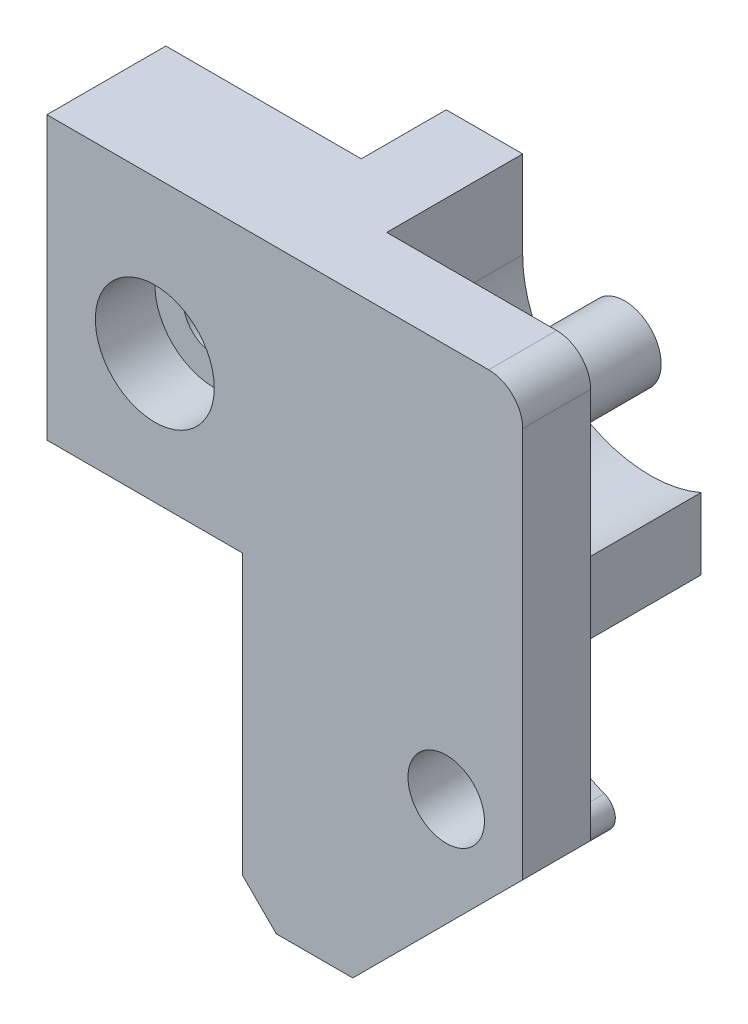
ISO-10303-21;
HEADER;
FILE_DESCRIPTION(('STEP AP214'),'2;1');
FILE_NAME('part.step','',(''),(''),'','','');
FILE_SCHEMA(('AUTOMOTIVE_DESIGN { 1 0 10303 214 1 1 1 1 }'));
ENDSEC;
DATA;
#1=APPLICATION_CONTEXT('core data for automotive mechanical design processes');
#2=APPLICATION_PROTOCOL_DEFINITION('international standard','automotive_design',2000,#1);
#3=PRODUCT_CONTEXT('',#1,'mechanical');
#4=PRODUCT('Part','Part','',(#3));
#5=PRODUCT_RELATED_PRODUCT_CATEGORY('part','',(#4));
#6=PRODUCT_DEFINITION_FORMATION('','',#4);
#7=PRODUCT_DEFINITION_CONTEXT('part definition',#1,'design');
#8=PRODUCT_DEFINITION('design','',#6,#7);
#9=PRODUCT_DEFINITION_SHAPE('','',#8);
#10=(LENGTH_UNIT() NAMED_UNIT(*) SI_UNIT(.MILLI.,.METRE.));
#11=(NAMED_UNIT(*) PLANE_ANGLE_UNIT() SI_UNIT($,.RADIAN.));
#12=(NAMED_UNIT(*) SI_UNIT($,.STERADIAN.) SOLID_ANGLE_UNIT());
#13=UNCERTAINTY_MEASURE_WITH_UNIT(LENGTH_MEASURE(1.E-05),#10,'distance_accuracy_value','');
#14=(GEOMETRIC_REPRESENTATION_CONTEXT(3) GLOBAL_UNCERTAINTY_ASSIGNED_CONTEXT((#13)) GLOBAL_UNIT_ASSIGNED_CONTEXT((#10,
#11,#12)) REPRESENTATION_CONTEXT('',''));
#15=CARTESIAN_POINT('',(0.,0.,0.));
#16=DIRECTION('',(0.,0.,1.));
#17=DIRECTION('',(1.,0.,0.));
#18=AXIS2_PLACEMENT_3D('',#15,#16,#17);
#19=CARTESIAN_POINT('',(23.5,29.8639610306789,-8.));
#20=DIRECTION('',(0.,0.,1.));
#21=DIRECTION('',(1.,0.,0.));
#22=AXIS2_PLACEMENT_3D('',#19,#20,#21);
#23=CYLINDRICAL_SURFACE('',#22,2.15);
#24=CARTESIAN_POINT('',(23.5,29.8639610306789,0.));
#25=DIRECTION('',(0.,0.,1.));
#26=DIRECTION('',(1.,0.,0.));
#27=AXIS2_PLACEMENT_3D('',#24,#25,#26);
#28=CIRCLE('',#27,2.15);
#29=CARTESIAN_POINT('',(25.65,29.8639610306789,0.));
#30=VERTEX_POINT('',#29);
#31=EDGE_CURVE('E316',#30,#30,#28,.F.);
#32=ORIENTED_EDGE('',*,*,#31,.T.);
#33=EDGE_LOOP('',(#32));
#34=FACE_BOUND('',#33,.T.);
#35=CARTESIAN_POINT('',(23.5,29.8639610306789,-6.5));
#36=DIRECTION('',(0.,0.,-1.));
#37=DIRECTION('',(-1.,0.,0.));
#38=AXIS2_PLACEMENT_3D('',#35,#36,#37);
#39=CIRCLE('',#38,2.15);
#40=CARTESIAN_POINT('',(21.35,29.8639610306789,-6.5));
#41=VERTEX_POINT('',#40);
#42=EDGE_CURVE('E641',#41,#41,#39,.T.);
#43=ORIENTED_EDGE('',*,*,#42,.F.);
#44=EDGE_LOOP('',(#43));
#45=FACE_BOUND('',#44,.T.);
#46=ADVANCED_FACE('F39',(#34,#45),#23,.T.);
#47=CARTESIAN_POINT('',(23.5,29.8639610306789,-8.));
#48=DIRECTION('',(0.,0.,-1.));
#49=DIRECTION('',(-1.,0.,0.));
#50=AXIS2_PLACEMENT_3D('',#47,#48,#49);
#51=PLANE('',#50);
#52=DIRECTION('',(1.,0.,0.));
#53=VECTOR('',#52,1.);
#54=CARTESIAN_POINT('',(0.,18.4139610306789,-8.));
#55=LINE('',#54,#53);
#56=CARTESIAN_POINT('',(11.5,18.4139610306789,-8.));
#57=VERTEX_POINT('',#56);
#58=CARTESIAN_POINT('',(19.7450033288963,18.4139610306789,-8.));
#59=VERTEX_POINT('',#58);
#60=EDGE_CURVE('E226',#57,#59,#55,.T.);
#61=ORIENTED_EDGE('',*,*,#60,.F.);
#62=DIRECTION('',(0.,1.,0.));
#63=VECTOR('',#62,1.);
#64=CARTESIAN_POINT('',(11.5,0.,-8.));
#65=LINE('',#64,#63);
#66=CARTESIAN_POINT('',(11.5,35.,-8.));
#67=VERTEX_POINT('',#66);
#68=EDGE_CURVE('E635',#57,#67,#65,.T.);
#69=ORIENTED_EDGE('',*,*,#68,.T.);
#70=DIRECTION('',(1.,0.,0.));
#71=VECTOR('',#70,1.);
#72=CARTESIAN_POINT('',(0.,35.,-8.));
#73=LINE('',#72,#71);
#74=CARTESIAN_POINT('',(16.,35.,-8.));
#75=VERTEX_POINT('',#74);
#76=EDGE_CURVE('E240',#67,#75,#73,.T.);
#77=ORIENTED_EDGE('',*,*,#76,.T.);
#78=DIRECTION('',(0.,1.,0.));
#79=VECTOR('',#78,1.);
#80=CARTESIAN_POINT('',(16.,0.,-8.));
#81=LINE('',#80,#79);
#82=CARTESIAN_POINT('',(16.,29.8639610306789,-8.));
#83=VERTEX_POINT('',#82);
#84=EDGE_CURVE('E232',#83,#75,#81,.T.);
#85=ORIENTED_EDGE('',*,*,#84,.F.);
#86=CARTESIAN_POINT('',(23.5,29.8639610306789,-8.));
#87=DIRECTION('',(0.,0.,-1.));
#88=DIRECTION('',(-1.,0.,0.));
#89=AXIS2_PLACEMENT_3D('',#86,#87,#88);
#90=CIRCLE('',#89,7.5);
#91=CARTESIAN_POINT('',(26.5,22.9900974882452,-8.));
#92=VERTEX_POINT('',#91);
#93=EDGE_CURVE('E236',#92,#83,#90,.T.);
#94=ORIENTED_EDGE('',*,*,#93,.F.);
#95=DIRECTION('',(0.,-1.,0.));
#96=VECTOR('',#95,1.);
#97=CARTESIAN_POINT('',(26.5,0.,-8.));
#98=LINE('',#97,#96);
#99=CARTESIAN_POINT('',(26.5,18.7923446805644,-8.));
#100=VERTEX_POINT('',#99);
#101=EDGE_CURVE('E206',#92,#100,#98,.T.);
#102=ORIENTED_EDGE('',*,*,#101,.T.);
#103=CARTESIAN_POINT('',(23.5,11.8639610306789,-8.));
#104=DIRECTION('',(0.,0.,-1.));
#105=DIRECTION('',(-1.,0.,0.));
#106=AXIS2_PLACEMENT_3D('',#103,#104,#105);
#107=CIRCLE('',#106,7.55);
#108=EDGE_CURVE('E249',#59,#100,#107,.T.);
#109=ORIENTED_EDGE('',*,*,#108,.F.);
#110=EDGE_LOOP('',(#61,#69,#77,#85,#94,#102,#109));
#111=FACE_BOUND('',#110,.T.);
#112=ADVANCED_FACE('F357',(#111),#51,.T.);
#113=CARTESIAN_POINT('',(0.,0.,4.));
#114=DIRECTION('',(1.,0.,0.));
#115=DIRECTION('',(0.,0.,-1.));
#116=AXIS2_PLACEMENT_3D('',#113,#114,#115);
#117=PLANE('',#116);
#118=DIRECTION('',(0.,1.,0.));
#119=VECTOR('',#118,1.);
#120=CARTESIAN_POINT('',(0.,0.,-3.));
#121=LINE('',#120,#119);
#122=CARTESIAN_POINT('',(0.,18.4139610306789,-3.));
#123=VERTEX_POINT('',#122);
#124=CARTESIAN_POINT('',(0.,35.,-3.));
#125=VERTEX_POINT('',#124);
#126=EDGE_CURVE('E180',#123,#125,#121,.T.);
#127=ORIENTED_EDGE('',*,*,#126,.F.);
#128=DIRECTION('',(0.,0.,-1.));
#129=VECTOR('',#128,1.);
#130=CARTESIAN_POINT('',(0.,18.4139610306789,4.));
#131=LINE('',#130,#129);
#132=CARTESIAN_POINT('',(0.,18.4139610306789,4.));
#133=VERTEX_POINT('',#132);
#134=EDGE_CURVE('E193',#133,#123,#131,.T.);
#135=ORIENTED_EDGE('',*,*,#134,.F.);
#136=DIRECTION('',(0.,-1.,0.));
#137=VECTOR('',#136,1.);
#138=CARTESIAN_POINT('',(0.,0.,4.));
#139=LINE('',#138,#137);
#140=CARTESIAN_POINT('',(0.,35.,4.));
#141=VERTEX_POINT('',#140);
#142=EDGE_CURVE('E284',#141,#133,#139,.T.);
#143=ORIENTED_EDGE('',*,*,#142,.F.);
#144=DIRECTION('',(0.,0.,-1.));
#145=VECTOR('',#144,1.);
#146=CARTESIAN_POINT('',(0.,35.,4.));
#147=LINE('',#146,#145);
#148=EDGE_CURVE('E196',#141,#125,#147,.T.);
#149=ORIENTED_EDGE('',*,*,#148,.T.);
#150=EDGE_LOOP('',(#127,#135,#143,#149));
#151=FACE_BOUND('',#150,.T.);
#152=ADVANCED_FACE('F191',(#151),#117,.F.);
#153=CARTESIAN_POINT('',(0.,35.,4.));
#154=DIRECTION('',(0.,-1.,0.));
#155=DIRECTION('',(0.,0.,-1.));
#156=AXIS2_PLACEMENT_3D('',#153,#154,#155);
#157=PLANE('',#156);
#158=DIRECTION('',(0.,0.,-1.));
#159=VECTOR('',#158,1.);
#160=CARTESIAN_POINT('',(11.5,35.,-3.));
#161=LINE('',#160,#159);
#162=CARTESIAN_POINT('',(11.5,35.,-3.));
#163=VERTEX_POINT('',#162);
#164=EDGE_CURVE('E638',#163,#67,#161,.T.);
#165=ORIENTED_EDGE('',*,*,#164,.F.);
#166=DIRECTION('',(1.,0.,0.));
#167=VECTOR('',#166,1.);
#168=CARTESIAN_POINT('',(0.,35.,-3.));
#169=LINE('',#168,#167);
#170=EDGE_CURVE('E197',#125,#163,#169,.T.);
#171=ORIENTED_EDGE('',*,*,#170,.F.);
#172=ORIENTED_EDGE('',*,*,#148,.F.);
#173=DIRECTION('',(-1.,0.,0.));
#174=VECTOR('',#173,1.);
#175=CARTESIAN_POINT('',(0.,35.,4.));
#176=LINE('',#175,#174);
#177=CARTESIAN_POINT('',(26.,35.,4.));
#178=VERTEX_POINT('',#177);
#179=EDGE_CURVE('E295',#178,#141,#176,.T.);
#180=ORIENTED_EDGE('',*,*,#179,.F.);
#181=DIRECTION('',(0.,0.,-1.));
#182=VECTOR('',#181,1.);
#183=CARTESIAN_POINT('',(26.,35.,4.));
#184=LINE('',#183,#182);
#185=CARTESIAN_POINT('',(26.,35.,0.));
#186=VERTEX_POINT('',#185);
#187=EDGE_CURVE('E305',#178,#186,#184,.T.);
#188=ORIENTED_EDGE('',*,*,#187,.T.);
#189=DIRECTION('',(-1.,0.,0.));
#190=VECTOR('',#189,1.);
#191=CARTESIAN_POINT('',(0.,35.,0.));
#192=LINE('',#191,#190);
#193=CARTESIAN_POINT('',(16.,35.,0.));
#194=VERTEX_POINT('',#193);
#195=EDGE_CURVE('E287',#186,#194,#192,.T.);
#196=ORIENTED_EDGE('',*,*,#195,.T.);
#197=DIRECTION('',(0.,0.,1.));
#198=VECTOR('',#197,1.);
#199=CARTESIAN_POINT('',(16.,35.,-51.9004555785017));
#200=LINE('',#199,#198);
#201=EDGE_CURVE('E243',#75,#194,#200,.T.);
#202=ORIENTED_EDGE('',*,*,#201,.F.);
#203=ORIENTED_EDGE('',*,*,#76,.F.);
#204=EDGE_LOOP('',(#165,#171,#172,#180,#188,#196,#202,#203));
#205=FACE_BOUND('',#204,.T.);
#206=ADVANCED_FACE('F381',(#205),#157,.F.);
#207=CARTESIAN_POINT('',(0.,18.4139610306789,-51.9004555785017));
#208=DIRECTION('',(0.,-1.,0.));
#209=DIRECTION('',(1.,0.,0.));
#210=AXIS2_PLACEMENT_3D('',#207,#208,#209);
#211=PLANE('',#210);
#212=DIRECTION('',(-1.,0.,0.));
#213=VECTOR('',#212,1.);
#214=CARTESIAN_POINT('',(0.,18.4139610306789,-3.));
#215=LINE('',#214,#213);
#216=CARTESIAN_POINT('',(11.5,18.4139610306789,-3.));
#217=VERTEX_POINT('',#216);
#218=EDGE_CURVE('E175',#217,#123,#215,.T.);
#219=ORIENTED_EDGE('',*,*,#218,.F.);
#220=DIRECTION('',(0.,0.,-1.));
#221=VECTOR('',#220,1.);
#222=CARTESIAN_POINT('',(11.5,18.4139610306789,-3.));
#223=LINE('',#222,#221);
#224=EDGE_CURVE('E636',#217,#57,#223,.T.);
#225=ORIENTED_EDGE('',*,*,#224,.T.);
#226=ORIENTED_EDGE('',*,*,#60,.T.);
#227=DIRECTION('',(0.,0.,1.));
#228=VECTOR('',#227,1.);
#229=CARTESIAN_POINT('',(19.7450033288963,18.4139610306789,-51.9004555785017));
#230=LINE('',#229,#228);
#231=CARTESIAN_POINT('',(19.7450033288963,18.4139610306789,0.));
#232=VERTEX_POINT('',#231);
#233=EDGE_CURVE('E253',#59,#232,#230,.T.);
#234=ORIENTED_EDGE('',*,*,#233,.T.);
#235=DIRECTION('',(1.,0.,0.));
#236=VECTOR('',#235,1.);
#237=CARTESIAN_POINT('',(0.,18.4139610306789,0.));
#238=LINE('',#237,#236);
#239=CARTESIAN_POINT('',(11.5,18.4139610306789,0.));
#240=VERTEX_POINT('',#239);
#241=EDGE_CURVE('E218',#240,#232,#238,.T.);
#242=ORIENTED_EDGE('',*,*,#241,.F.);
#243=DIRECTION('',(0.,0.,-1.));
#244=VECTOR('',#243,1.);
#245=CARTESIAN_POINT('',(11.5,18.4139610306789,4.));
#246=LINE('',#245,#244);
#247=CARTESIAN_POINT('',(11.5,18.4139610306789,4.));
#248=VERTEX_POINT('',#247);
#249=EDGE_CURVE('E202',#248,#240,#246,.T.);
#250=ORIENTED_EDGE('',*,*,#249,.F.);
#251=DIRECTION('',(1.,0.,0.));
#252=VECTOR('',#251,1.);
#253=CARTESIAN_POINT('',(0.,18.4139610306789,4.));
#254=LINE('',#253,#252);
#255=EDGE_CURVE('E201',#133,#248,#254,.T.);
#256=ORIENTED_EDGE('',*,*,#255,.F.);
#257=ORIENTED_EDGE('',*,*,#134,.T.);
#258=EDGE_LOOP('',(#219,#225,#226,#234,#242,#250,#256,#257));
#259=FACE_BOUND('',#258,.T.);
#260=ADVANCED_FACE('F199',(#259),#211,.T.);
#261=CARTESIAN_POINT('',(6.35,26.,4.));
#262=DIRECTION('',(0.,0.,1.));
#263=DIRECTION('',(1.,0.,0.));
#264=AXIS2_PLACEMENT_3D('',#261,#262,#263);
#265=CYLINDRICAL_SURFACE('',#264,1.8288);
#266=CARTESIAN_POINT('',(6.35,26.,0.4948));
#267=DIRECTION('',(0.,0.,1.));
#268=DIRECTION('',(1.,0.,0.));
#269=AXIS2_PLACEMENT_3D('',#266,#267,#268);
#270=CIRCLE('',#269,1.8288);
#271=CARTESIAN_POINT('',(8.1788,26.,0.4948));
#272=VERTEX_POINT('',#271);
#273=EDGE_CURVE('E657',#272,#272,#270,.T.);
#274=ORIENTED_EDGE('',*,*,#273,.T.);
#275=EDGE_LOOP('',(#274));
#276=FACE_BOUND('',#275,.T.);
#277=CARTESIAN_POINT('',(6.35,26.,-3.));
#278=DIRECTION('',(0.,0.,-1.));
#279=DIRECTION('',(-1.,0.,0.));
#280=AXIS2_PLACEMENT_3D('',#277,#278,#279);
#281=CIRCLE('',#280,1.8288);
#282=CARTESIAN_POINT('',(4.5212,26.,-3.));
#283=VERTEX_POINT('',#282);
#284=EDGE_CURVE('E644',#283,#283,#281,.F.);
#285=ORIENTED_EDGE('',*,*,#284,.F.);
#286=EDGE_LOOP('',(#285));
#287=FACE_BOUND('',#286,.T.);
#288=ADVANCED_FACE('F379',(#276,#287),#265,.F.);
#289=CARTESIAN_POINT('',(26.,33.,0.));
#290=DIRECTION('',(0.,0.,1.));
#291=DIRECTION('',(1.,0.,0.));
#292=AXIS2_PLACEMENT_3D('',#289,#290,#291);
#293=PLANE('',#292);
#294=CARTESIAN_POINT('',(23.5,29.8639610306789,0.));
#295=DIRECTION('',(0.,0.,-1.));
#296=DIRECTION('',(-1.,0.,0.));
#297=AXIS2_PLACEMENT_3D('',#294,#295,#296);
#298=CIRCLE('',#297,7.5);
#299=CARTESIAN_POINT('',(26.5,22.9900974882452,0.));
#300=VERTEX_POINT('',#299);
#301=CARTESIAN_POINT('',(16.,29.8639610306789,0.));
#302=VERTEX_POINT('',#301);
#303=EDGE_CURVE('E215',#300,#302,#298,.T.);
#304=ORIENTED_EDGE('',*,*,#303,.T.);
#305=DIRECTION('',(0.,1.,0.));
#306=VECTOR('',#305,1.);
#307=CARTESIAN_POINT('',(16.,0.,0.));
#308=LINE('',#307,#306);
#309=EDGE_CURVE('E211',#302,#194,#308,.T.);
#310=ORIENTED_EDGE('',*,*,#309,.T.);
#311=ORIENTED_EDGE('',*,*,#195,.F.);
#312=CARTESIAN_POINT('',(26.,33.,0.));
#313=DIRECTION('',(0.,0.,1.));
#314=DIRECTION('',(1.,0.,0.));
#315=AXIS2_PLACEMENT_3D('',#312,#313,#314);
#316=CIRCLE('',#315,2.);
#317=CARTESIAN_POINT('',(28.,33.,0.));
#318=VERTEX_POINT('',#317);
#319=EDGE_CURVE('E300',#318,#186,#316,.T.);
#320=ORIENTED_EDGE('',*,*,#319,.F.);
#321=DIRECTION('',(0.,1.,0.));
#322=VECTOR('',#321,1.);
#323=CARTESIAN_POINT('',(28.,10.,0.));
#324=LINE('',#323,#322);
#325=CARTESIAN_POINT('',(28.,10.,0.));
#326=VERTEX_POINT('',#325);
#327=EDGE_CURVE('E298',#326,#318,#324,.T.);
#328=ORIENTED_EDGE('',*,*,#327,.F.);
#329=DIRECTION('',(0.707106781186547,0.707106781186548,0.));
#330=VECTOR('',#329,1.);
#331=CARTESIAN_POINT('',(18.,0.,0.));
#332=LINE('',#331,#330);
#333=CARTESIAN_POINT('',(21.1582561300546,3.15825613005459,0.));
#334=VERTEX_POINT('',#333);
#335=EDGE_CURVE('E281',#334,#326,#332,.T.);
#336=ORIENTED_EDGE('',*,*,#335,.F.);
#337=CARTESIAN_POINT('',(20.451149348868,3.86536291124113,0.));
#338=DIRECTION('',(0.,0.,-1.));
#339=DIRECTION('',(-1.,0.,0.));
#340=AXIS2_PLACEMENT_3D('',#337,#338,#339);
#341=CIRCLE('',#340,0.999999999999998);
#342=CARTESIAN_POINT('',(20.807324797528,4.79978200874067,0.));
#343=VERTEX_POINT('',#342);
#344=EDGE_CURVE('E214',#334,#343,#341,.F.);
#345=ORIENTED_EDGE('',*,*,#344,.T.);
#346=CARTESIAN_POINT('',(23.5,11.8639610306789,0.));
#347=DIRECTION('',(0.,0.,-1.));
#348=DIRECTION('',(-1.,0.,0.));
#349=AXIS2_PLACEMENT_3D('',#346,#347,#348);
#350=CIRCLE('',#349,7.55996858459081);
#351=CARTESIAN_POINT('',(19.725,5.31396103067893,0.));
#352=VERTEX_POINT('',#351);
#353=EDGE_CURVE('E219',#352,#343,#350,.F.);
#354=ORIENTED_EDGE('',*,*,#353,.F.);
#355=DIRECTION('',(1.,0.,0.));
#356=VECTOR('',#355,1.);
#357=CARTESIAN_POINT('',(0.,5.31396103067893,0.));
#358=LINE('',#357,#356);
#359=CARTESIAN_POINT('',(11.5,5.31396103067893,0.));
#360=VERTEX_POINT('',#359);
#361=EDGE_CURVE('E222',#360,#352,#358,.T.);
#362=ORIENTED_EDGE('',*,*,#361,.F.);
#363=DIRECTION('',(0.,-1.,0.));
#364=VECTOR('',#363,1.);
#365=CARTESIAN_POINT('',(11.5,0.,0.));
#366=LINE('',#365,#364);
#367=EDGE_CURVE('E652',#240,#360,#366,.T.);
#368=ORIENTED_EDGE('',*,*,#367,.F.);
#369=ORIENTED_EDGE('',*,*,#241,.T.);
#370=CARTESIAN_POINT('',(23.5,11.8639610306789,0.));
#371=DIRECTION('',(0.,0.,-1.));
#372=DIRECTION('',(-1.,0.,0.));
#373=AXIS2_PLACEMENT_3D('',#370,#371,#372);
#374=CIRCLE('',#373,7.55);
#375=CARTESIAN_POINT('',(26.5,18.7923446805644,0.));
#376=VERTEX_POINT('',#375);
#377=EDGE_CURVE('E229',#232,#376,#374,.T.);
#378=ORIENTED_EDGE('',*,*,#377,.T.);
#379=DIRECTION('',(0.,-1.,0.));
#380=VECTOR('',#379,1.);
#381=CARTESIAN_POINT('',(26.5,0.,0.));
#382=LINE('',#381,#380);
#383=EDGE_CURVE('E233',#300,#376,#382,.T.);
#384=ORIENTED_EDGE('',*,*,#383,.F.);
#385=EDGE_LOOP('',(#304,#310,#311,#320,#328,#336,#345,#354,#362,#368,#369,#378,#384));
#386=FACE_BOUND('',#385,.T.);
#387=CARTESIAN_POINT('',(23.5,11.8639610306789,0.));
#388=DIRECTION('',(0.,0.,-1.));
#389=DIRECTION('',(-1.,0.,0.));
#390=AXIS2_PLACEMENT_3D('',#387,#388,#389);
#391=CIRCLE('',#390,2.25);
#392=CARTESIAN_POINT('',(21.25,11.8639610306789,0.));
#393=VERTEX_POINT('',#392);
#394=EDGE_CURVE('E277',#393,#393,#391,.T.);
#395=ORIENTED_EDGE('',*,*,#394,.F.);
#396=EDGE_LOOP('',(#395));
#397=FACE_BOUND('',#396,.T.);
#398=ORIENTED_EDGE('',*,*,#31,.F.);
#399=EDGE_LOOP('',(#398));
#400=FACE_BOUND('',#399,.T.);
#401=ADVANCED_FACE('F376',(#386,#397,#400),#293,.F.);
#402=CARTESIAN_POINT('',(0.,0.,4.));
#403=DIRECTION('',(0.,1.,0.));
#404=DIRECTION('',(0.,0.,1.));
#405=AXIS2_PLACEMENT_3D('',#402,#403,#404);
#406=PLANE('',#405);
#407=DIRECTION('',(1.,0.,0.));
#408=VECTOR('',#407,1.);
#409=CARTESIAN_POINT('',(0.,0.,4.));
#410=LINE('',#409,#408);
#411=CARTESIAN_POINT('',(13.5,0.,4.));
#412=VERTEX_POINT('',#411);
#413=CARTESIAN_POINT('',(18.,0.,4.));
#414=VERTEX_POINT('',#413);
#415=EDGE_CURVE('E286',#412,#414,#410,.T.);
#416=ORIENTED_EDGE('',*,*,#415,.F.);
#417=DIRECTION('',(0.,0.,-1.));
#418=VECTOR('',#417,1.);
#419=CARTESIAN_POINT('',(13.5,0.,4.));
#420=LINE('',#419,#418);
#421=CARTESIAN_POINT('',(13.5,0.,-8.));
#422=VERTEX_POINT('',#421);
#423=EDGE_CURVE('E322',#412,#422,#420,.T.);
#424=ORIENTED_EDGE('',*,*,#423,.T.);
#425=DIRECTION('',(-1.,0.,0.));
#426=VECTOR('',#425,1.);
#427=CARTESIAN_POINT('',(0.,0.,-8.));
#428=LINE('',#427,#426);
#429=CARTESIAN_POINT('',(18.,0.,-8.));
#430=VERTEX_POINT('',#429);
#431=EDGE_CURVE('E266',#430,#422,#428,.T.);
#432=ORIENTED_EDGE('',*,*,#431,.F.);
#433=DIRECTION('',(0.,0.,-1.));
#434=VECTOR('',#433,1.);
#435=CARTESIAN_POINT('',(18.,0.,4.));
#436=LINE('',#435,#434);
#437=EDGE_CURVE('E314',#414,#430,#436,.T.);
#438=ORIENTED_EDGE('',*,*,#437,.F.);
#439=EDGE_LOOP('',(#416,#424,#432,#438));
#440=FACE_BOUND('',#439,.T.);
#441=ADVANCED_FACE('F329',(#440),#406,.F.);
#442=CARTESIAN_POINT('',(18.,0.,4.));
#443=DIRECTION('',(-0.707106781186548,0.707106781186547,0.));
#444=DIRECTION('',(-0.707106781186547,-0.707106781186548,0.));
#445=AXIS2_PLACEMENT_3D('',#442,#443,#444);
#446=PLANE('',#445);
#447=ORIENTED_EDGE('',*,*,#437,.T.);
#448=DIRECTION('',(-0.707106781186548,-0.707106781186548,0.));
#449=VECTOR('',#448,1.);
#450=CARTESIAN_POINT('',(9.,-9.,-8.));
#451=LINE('',#450,#449);
#452=CARTESIAN_POINT('',(21.1582561300546,3.15825613005459,-8.));
#453=VERTEX_POINT('',#452);
#454=EDGE_CURVE('E258',#453,#430,#451,.T.);
#455=ORIENTED_EDGE('',*,*,#454,.F.);
#456=DIRECTION('',(0.,0.,1.));
#457=VECTOR('',#456,1.);
#458=CARTESIAN_POINT('',(21.1582561300546,3.15825613005459,-51.9004555785017));
#459=LINE('',#458,#457);
#460=EDGE_CURVE('E263',#453,#334,#459,.T.);
#461=ORIENTED_EDGE('',*,*,#460,.T.);
#462=ORIENTED_EDGE('',*,*,#335,.T.);
#463=DIRECTION('',(0.,0.,-1.));
#464=VECTOR('',#463,1.);
#465=CARTESIAN_POINT('',(28.,10.,4.));
#466=LINE('',#465,#464);
#467=CARTESIAN_POINT('',(28.,10.,4.));
#468=VERTEX_POINT('',#467);
#469=EDGE_CURVE('E311',#468,#326,#466,.T.);
#470=ORIENTED_EDGE('',*,*,#469,.F.);
#471=DIRECTION('',(0.707106781186547,0.707106781186548,0.));
#472=VECTOR('',#471,1.);
#473=CARTESIAN_POINT('',(18.,0.,4.));
#474=LINE('',#473,#472);
#475=EDGE_CURVE('E289',#414,#468,#474,.T.);
#476=ORIENTED_EDGE('',*,*,#475,.F.);
#477=EDGE_LOOP('',(#447,#455,#461,#462,#470,#476));
#478=FACE_BOUND('',#477,.T.);
#479=ADVANCED_FACE('F337',(#478),#446,.F.);
#480=CARTESIAN_POINT('',(28.,10.,4.));
#481=DIRECTION('',(-1.,0.,0.));
#482=DIRECTION('',(0.,-1.,0.));
#483=AXIS2_PLACEMENT_3D('',#480,#481,#482);
#484=PLANE('',#483);
#485=ORIENTED_EDGE('',*,*,#327,.T.);
#486=DIRECTION('',(0.,0.,-1.));
#487=VECTOR('',#486,1.);
#488=CARTESIAN_POINT('',(28.,33.,4.));
#489=LINE('',#488,#487);
#490=CARTESIAN_POINT('',(28.,33.,4.));
#491=VERTEX_POINT('',#490);
#492=EDGE_CURVE('E308',#491,#318,#489,.T.);
#493=ORIENTED_EDGE('',*,*,#492,.F.);
#494=DIRECTION('',(0.,1.,0.));
#495=VECTOR('',#494,1.);
#496=CARTESIAN_POINT('',(28.,10.,4.));
#497=LINE('',#496,#495);
#498=EDGE_CURVE('E291',#468,#491,#497,.T.);
#499=ORIENTED_EDGE('',*,*,#498,.F.);
#500=ORIENTED_EDGE('',*,*,#469,.T.);
#501=EDGE_LOOP('',(#485,#493,#499,#500));
#502=FACE_BOUND('',#501,.T.);
#503=ADVANCED_FACE('F387',(#502),#484,.F.);
#504=CARTESIAN_POINT('',(26.,33.,4.));
#505=DIRECTION('',(0.,0.,-1.));
#506=DIRECTION('',(-1.,0.,0.));
#507=AXIS2_PLACEMENT_3D('',#504,#505,#506);
#508=CYLINDRICAL_SURFACE('',#507,2.);
#509=ORIENTED_EDGE('',*,*,#319,.T.);
#510=ORIENTED_EDGE('',*,*,#187,.F.);
#511=CARTESIAN_POINT('',(26.,33.,4.));
#512=DIRECTION('',(0.,0.,1.));
#513=DIRECTION('',(1.,0.,0.));
#514=AXIS2_PLACEMENT_3D('',#511,#512,#513);
#515=CIRCLE('',#514,2.);
#516=EDGE_CURVE('E293',#491,#178,#515,.T.);
#517=ORIENTED_EDGE('',*,*,#516,.F.);
#518=ORIENTED_EDGE('',*,*,#492,.T.);
#519=EDGE_LOOP('',(#509,#510,#517,#518));
#520=FACE_BOUND('',#519,.T.);
#521=ADVANCED_FACE('F374',(#520),#508,.T.);
#522=CARTESIAN_POINT('',(26.,33.,4.));
#523=DIRECTION('',(0.,0.,1.));
#524=DIRECTION('',(1.,0.,0.));
#525=AXIS2_PLACEMENT_3D('',#522,#523,#524);
#526=PLANE('',#525);
#527=CARTESIAN_POINT('',(6.35,26.,4.));
#528=DIRECTION('',(0.,0.,1.));
#529=DIRECTION('',(1.,0.,0.));
#530=AXIS2_PLACEMENT_3D('',#527,#528,#529);
#531=CIRCLE('',#530,3.5);
#532=CARTESIAN_POINT('',(9.85,26.,4.));
#533=VERTEX_POINT('',#532);
#534=EDGE_CURVE('E666',#533,#533,#531,.T.);
#535=ORIENTED_EDGE('',*,*,#534,.F.);
#536=EDGE_LOOP('',(#535));
#537=FACE_BOUND('',#536,.T.);
#538=DIRECTION('',(0.,-1.,0.));
#539=VECTOR('',#538,1.);
#540=CARTESIAN_POINT('',(11.5,0.,4.));
#541=LINE('',#540,#539);
#542=CARTESIAN_POINT('',(11.5,2.,4.));
#543=VERTEX_POINT('',#542);
#544=EDGE_CURVE('E203',#248,#543,#541,.T.);
#545=ORIENTED_EDGE('',*,*,#544,.T.);
#546=DIRECTION('',(-0.707106781186545,0.70710678118655,0.));
#547=VECTOR('',#546,1.);
#548=CARTESIAN_POINT('',(3.24999999999995,10.2500000000001,4.));
#549=LINE('',#548,#547);
#550=EDGE_CURVE('E11',#543,#412,#549,.F.);
#551=ORIENTED_EDGE('',*,*,#550,.T.);
#552=ORIENTED_EDGE('',*,*,#415,.T.);
#553=ORIENTED_EDGE('',*,*,#475,.T.);
#554=ORIENTED_EDGE('',*,*,#498,.T.);
#555=ORIENTED_EDGE('',*,*,#516,.T.);
#556=ORIENTED_EDGE('',*,*,#179,.T.);
#557=ORIENTED_EDGE('',*,*,#142,.T.);
#558=ORIENTED_EDGE('',*,*,#255,.T.);
#559=EDGE_LOOP('',(#545,#551,#552,#553,#554,#555,#556,#557,#558));
#560=FACE_BOUND('',#559,.T.);
#561=CARTESIAN_POINT('',(23.5,11.8639610306789,4.));
#562=DIRECTION('',(0.,0.,-1.));
#563=DIRECTION('',(-1.,0.,0.));
#564=AXIS2_PLACEMENT_3D('',#561,#562,#563);
#565=CIRCLE('',#564,2.25);
#566=CARTESIAN_POINT('',(21.25,11.8639610306789,4.));
#567=VERTEX_POINT('',#566);
#568=EDGE_CURVE('E278',#567,#567,#565,.T.);
#569=ORIENTED_EDGE('',*,*,#568,.T.);
#570=EDGE_LOOP('',(#569));
#571=FACE_BOUND('',#570,.T.);
#572=ADVANCED_FACE('F343',(#537,#560,#571),#526,.T.);
#573=CARTESIAN_POINT('',(23.5,11.8639610306789,4.));
#574=DIRECTION('',(0.,0.,-1.));
#575=DIRECTION('',(-1.,0.,0.));
#576=AXIS2_PLACEMENT_3D('',#573,#574,#575);
#577=CYLINDRICAL_SURFACE('',#576,2.25);
#578=ORIENTED_EDGE('',*,*,#568,.F.);
#579=EDGE_LOOP('',(#578));
#580=FACE_BOUND('',#579,.T.);
#581=ORIENTED_EDGE('',*,*,#394,.T.);
#582=EDGE_LOOP('',(#581));
#583=FACE_BOUND('',#582,.T.);
#584=ADVANCED_FACE('F368',(#580,#583),#577,.F.);
#585=ORIENTED_EDGE('',*,*,#431,.T.);
#586=DIRECTION('',(0.707106781186545,-0.70710678118655,0.));
#587=VECTOR('',#586,1.);
#588=CARTESIAN_POINT('',(3.5680194846605,9.93198051533956,-8.));
#589=LINE('',#588,#587);
#590=CARTESIAN_POINT('',(11.5,2.00000000000001,-8.));
#591=VERTEX_POINT('',#590);
#592=EDGE_CURVE('E61',#422,#591,#589,.F.);
#593=ORIENTED_EDGE('',*,*,#592,.T.);
#594=DIRECTION('',(0.,-1.,0.));
#595=VECTOR('',#594,1.);
#596=CARTESIAN_POINT('',(11.5,0.,-8.));
#597=LINE('',#596,#595);
#598=CARTESIAN_POINT('',(11.5,5.31396103067893,-8.));
#599=VERTEX_POINT('',#598);
#600=EDGE_CURVE('E656',#599,#591,#597,.T.);
#601=ORIENTED_EDGE('',*,*,#600,.F.);
#602=DIRECTION('',(1.,0.,0.));
#603=VECTOR('',#602,1.);
#604=CARTESIAN_POINT('',(0.,5.31396103067893,-8.));
#605=LINE('',#604,#603);
#606=CARTESIAN_POINT('',(19.725,5.31396103067893,-8.));
#607=VERTEX_POINT('',#606);
#608=EDGE_CURVE('E248',#599,#607,#605,.T.);
#609=ORIENTED_EDGE('',*,*,#608,.T.);
#610=CARTESIAN_POINT('',(23.5,11.8639610306789,-8.));
#611=DIRECTION('',(0.,0.,-1.));
#612=DIRECTION('',(-1.,0.,0.));
#613=AXIS2_PLACEMENT_3D('',#610,#611,#612);
#614=CIRCLE('',#613,7.55996858459081);
#615=CARTESIAN_POINT('',(20.807324797528,4.79978200874067,-8.));
#616=VERTEX_POINT('',#615);
#617=EDGE_CURVE('E256',#607,#616,#614,.F.);
#618=ORIENTED_EDGE('',*,*,#617,.T.);
#619=CARTESIAN_POINT('',(20.451149348868,3.86536291124113,-8.));
#620=DIRECTION('',(0.,0.,-1.));
#621=DIRECTION('',(-1.,0.,0.));
#622=AXIS2_PLACEMENT_3D('',#619,#620,#621);
#623=CIRCLE('',#622,0.999999999999998);
#624=EDGE_CURVE('E259',#453,#616,#623,.F.);
#625=ORIENTED_EDGE('',*,*,#624,.F.);
#626=ORIENTED_EDGE('',*,*,#454,.T.);
#627=EDGE_LOOP('',(#585,#593,#601,#609,#618,#625,#626));
#628=FACE_BOUND('',#627,.T.);
#629=ADVANCED_FACE('F333',(#628),#51,.T.);
#630=CARTESIAN_POINT('',(16.,0.,-51.9004555785017));
#631=DIRECTION('',(1.,0.,0.));
#632=DIRECTION('',(0.,0.,-1.));
#633=AXIS2_PLACEMENT_3D('',#630,#631,#632);
#634=PLANE('',#633);
#635=DIRECTION('',(0.,0.,1.));
#636=VECTOR('',#635,1.);
#637=CARTESIAN_POINT('',(16.,29.8639610306789,-51.9004555785017));
#638=LINE('',#637,#636);
#639=EDGE_CURVE('E246',#83,#302,#638,.T.);
#640=ORIENTED_EDGE('',*,*,#639,.F.);
#641=ORIENTED_EDGE('',*,*,#84,.T.);
#642=ORIENTED_EDGE('',*,*,#201,.T.);
#643=ORIENTED_EDGE('',*,*,#309,.F.);
#644=EDGE_LOOP('',(#640,#641,#642,#643));
#645=FACE_BOUND('',#644,.T.);
#646=ADVANCED_FACE('F456',(#645),#634,.T.);
#647=CARTESIAN_POINT('',(20.451149348868,3.86536291124113,-51.9004555785017));
#648=DIRECTION('',(0.,0.,1.));
#649=DIRECTION('',(1.,0.,0.));
#650=AXIS2_PLACEMENT_3D('',#647,#648,#649);
#651=CYLINDRICAL_SURFACE('',#650,0.999999999999998);
#652=ORIENTED_EDGE('',*,*,#460,.F.);
#653=ORIENTED_EDGE('',*,*,#624,.T.);
#654=DIRECTION('',(0.,0.,1.));
#655=VECTOR('',#654,1.);
#656=CARTESIAN_POINT('',(20.807324797528,4.79978200874067,-51.9004555785017));
#657=LINE('',#656,#655);
#658=EDGE_CURVE('E262',#616,#343,#657,.T.);
#659=ORIENTED_EDGE('',*,*,#658,.T.);
#660=ORIENTED_EDGE('',*,*,#344,.F.);
#661=EDGE_LOOP('',(#652,#653,#659,#660));
#662=FACE_BOUND('',#661,.T.);
#663=ADVANCED_FACE('F462',(#662),#651,.T.);
#664=CARTESIAN_POINT('',(23.5,11.8639610306789,-51.9004555785017));
#665=DIRECTION('',(0.,0.,1.));
#666=DIRECTION('',(1.,0.,0.));
#667=AXIS2_PLACEMENT_3D('',#664,#665,#666);
#668=CYLINDRICAL_SURFACE('',#667,7.55996858459081);
#669=ORIENTED_EDGE('',*,*,#617,.F.);
#670=DIRECTION('',(0.,0.,1.));
#671=VECTOR('',#670,1.);
#672=CARTESIAN_POINT('',(19.725,5.31396103067893,-51.9004555785017));
#673=LINE('',#672,#671);
#674=EDGE_CURVE('E223',#607,#352,#673,.T.);
#675=ORIENTED_EDGE('',*,*,#674,.T.);
#676=ORIENTED_EDGE('',*,*,#353,.T.);
#677=ORIENTED_EDGE('',*,*,#658,.F.);
#678=EDGE_LOOP('',(#669,#675,#676,#677));
#679=FACE_BOUND('',#678,.T.);
#680=ADVANCED_FACE('F469',(#679),#668,.F.);
#681=CARTESIAN_POINT('',(0.,5.31396103067893,-51.9004555785017));
#682=DIRECTION('',(0.,-1.,0.));
#683=DIRECTION('',(1.,0.,0.));
#684=AXIS2_PLACEMENT_3D('',#681,#682,#683);
#685=PLANE('',#684);
#686=ORIENTED_EDGE('',*,*,#608,.F.);
#687=DIRECTION('',(0.,0.,-1.));
#688=VECTOR('',#687,1.);
#689=CARTESIAN_POINT('',(11.5,5.31396103067893,4.));
#690=LINE('',#689,#688);
#691=EDGE_CURVE('E319',#360,#599,#690,.T.);
#692=ORIENTED_EDGE('',*,*,#691,.F.);
#693=ORIENTED_EDGE('',*,*,#361,.T.);
#694=ORIENTED_EDGE('',*,*,#674,.F.);
#695=EDGE_LOOP('',(#686,#692,#693,#694));
#696=FACE_BOUND('',#695,.T.);
#697=ADVANCED_FACE('F477',(#696),#685,.F.);
#698=CARTESIAN_POINT('',(23.5,11.8639610306789,-51.9004555785017));
#699=DIRECTION('',(0.,0.,1.));
#700=DIRECTION('',(1.,0.,0.));
#701=AXIS2_PLACEMENT_3D('',#698,#699,#700);
#702=CYLINDRICAL_SURFACE('',#701,7.55);
#703=ORIENTED_EDGE('',*,*,#233,.F.);
#704=ORIENTED_EDGE('',*,*,#108,.T.);
#705=DIRECTION('',(0.,0.,1.));
#706=VECTOR('',#705,1.);
#707=CARTESIAN_POINT('',(26.5,18.7923446805644,-51.9004555785017));
#708=LINE('',#707,#706);
#709=EDGE_CURVE('E252',#100,#376,#708,.T.);
#710=ORIENTED_EDGE('',*,*,#709,.T.);
#711=ORIENTED_EDGE('',*,*,#377,.F.);
#712=EDGE_LOOP('',(#703,#704,#710,#711));
#713=FACE_BOUND('',#712,.T.);
#714=ADVANCED_FACE('F485',(#713),#702,.F.);
#715=CARTESIAN_POINT('',(26.5,0.,-51.9004555785017));
#716=DIRECTION('',(-1.,0.,0.));
#717=DIRECTION('',(0.,-1.,0.));
#718=AXIS2_PLACEMENT_3D('',#715,#716,#717);
#719=PLANE('',#718);
#720=ORIENTED_EDGE('',*,*,#101,.F.);
#721=DIRECTION('',(0.,0.,1.));
#722=VECTOR('',#721,1.);
#723=CARTESIAN_POINT('',(26.5,22.9900974882452,-51.9004555785017));
#724=LINE('',#723,#722);
#725=EDGE_CURVE('E237',#92,#300,#724,.T.);
#726=ORIENTED_EDGE('',*,*,#725,.T.);
#727=ORIENTED_EDGE('',*,*,#383,.T.);
#728=ORIENTED_EDGE('',*,*,#709,.F.);
#729=EDGE_LOOP('',(#720,#726,#727,#728));
#730=FACE_BOUND('',#729,.T.);
#731=ADVANCED_FACE('F493',(#730),#719,.F.);
#732=CARTESIAN_POINT('',(23.5,29.8639610306789,-51.9004555785017));
#733=DIRECTION('',(0.,0.,1.));
#734=DIRECTION('',(1.,0.,0.));
#735=AXIS2_PLACEMENT_3D('',#732,#733,#734);
#736=CYLINDRICAL_SURFACE('',#735,7.5);
#737=ORIENTED_EDGE('',*,*,#725,.F.);
#738=ORIENTED_EDGE('',*,*,#93,.T.);
#739=ORIENTED_EDGE('',*,*,#639,.T.);
#740=ORIENTED_EDGE('',*,*,#303,.F.);
#741=EDGE_LOOP('',(#737,#738,#739,#740));
#742=FACE_BOUND('',#741,.T.);
#743=ADVANCED_FACE('F501',(#742),#736,.F.);
#744=CARTESIAN_POINT('',(11.5,0.,4.));
#745=DIRECTION('',(1.,0.,0.));
#746=DIRECTION('',(0.,0.,-1.));
#747=AXIS2_PLACEMENT_3D('',#744,#745,#746);
#748=PLANE('',#747);
#749=ORIENTED_EDGE('',*,*,#600,.T.);
#750=DIRECTION('',(0.,0.,1.));
#751=VECTOR('',#750,1.);
#752=CARTESIAN_POINT('',(11.5,2.00000000000001,4.));
#753=LINE('',#752,#751);
#754=EDGE_CURVE('E47',#591,#543,#753,.T.);
#755=ORIENTED_EDGE('',*,*,#754,.T.);
#756=ORIENTED_EDGE('',*,*,#544,.F.);
#757=ORIENTED_EDGE('',*,*,#249,.T.);
#758=ORIENTED_EDGE('',*,*,#367,.T.);
#759=ORIENTED_EDGE('',*,*,#691,.T.);
#760=EDGE_LOOP('',(#749,#755,#756,#757,#758,#759));
#761=FACE_BOUND('',#760,.T.);
#762=ADVANCED_FACE('F508',(#761),#748,.F.);
#763=CARTESIAN_POINT('',(8.1788,26.,0.4948));
#764=DIRECTION('',(0.,0.,-1.));
#765=DIRECTION('',(-1.,0.,0.));
#766=AXIS2_PLACEMENT_3D('',#763,#764,#765);
#767=PLANE('',#766);
#768=ORIENTED_EDGE('',*,*,#273,.F.);
#769=EDGE_LOOP('',(#768));
#770=FACE_BOUND('',#769,.T.);
#771=CARTESIAN_POINT('',(6.35,26.,0.4948));
#772=DIRECTION('',(0.,0.,1.));
#773=DIRECTION('',(1.,0.,0.));
#774=AXIS2_PLACEMENT_3D('',#771,#772,#773);
#775=CIRCLE('',#774,3.5);
#776=CARTESIAN_POINT('',(9.85,26.,0.4948));
#777=VERTEX_POINT('',#776);
#778=EDGE_CURVE('E663',#777,#777,#775,.T.);
#779=ORIENTED_EDGE('',*,*,#778,.T.);
#780=EDGE_LOOP('',(#779));
#781=FACE_BOUND('',#780,.T.);
#782=ADVANCED_FACE('F515',(#770,#781),#767,.F.);
#783=CARTESIAN_POINT('',(6.35,26.,4.));
#784=DIRECTION('',(0.,0.,1.));
#785=DIRECTION('',(1.,0.,0.));
#786=AXIS2_PLACEMENT_3D('',#783,#784,#785);
#787=CYLINDRICAL_SURFACE('',#786,3.5);
#788=ORIENTED_EDGE('',*,*,#778,.F.);
#789=EDGE_LOOP('',(#788));
#790=FACE_BOUND('',#789,.T.);
#791=ORIENTED_EDGE('',*,*,#534,.T.);
#792=EDGE_LOOP('',(#791));
#793=FACE_BOUND('',#792,.T.);
#794=ADVANCED_FACE('F521',(#790,#793),#787,.F.);
#795=CARTESIAN_POINT('',(11.5,0.,-3.));
#796=DIRECTION('',(-1.,0.,0.));
#797=DIRECTION('',(0.,0.,1.));
#798=AXIS2_PLACEMENT_3D('',#795,#796,#797);
#799=PLANE('',#798);
#800=ORIENTED_EDGE('',*,*,#68,.F.);
#801=ORIENTED_EDGE('',*,*,#224,.F.);
#802=DIRECTION('',(0.,1.,0.));
#803=VECTOR('',#802,1.);
#804=CARTESIAN_POINT('',(11.5,0.,-3.));
#805=LINE('',#804,#803);
#806=EDGE_CURVE('E182',#217,#163,#805,.T.);
#807=ORIENTED_EDGE('',*,*,#806,.T.);
#808=ORIENTED_EDGE('',*,*,#164,.T.);
#809=EDGE_LOOP('',(#800,#801,#807,#808));
#810=FACE_BOUND('',#809,.T.);
#811=ADVANCED_FACE('F354',(#810),#799,.T.);
#812=CARTESIAN_POINT('',(0.,0.,-3.));
#813=DIRECTION('',(0.,0.,-1.));
#814=DIRECTION('',(-1.,0.,0.));
#815=AXIS2_PLACEMENT_3D('',#812,#813,#814);
#816=PLANE('',#815);
#817=ORIENTED_EDGE('',*,*,#806,.F.);
#818=ORIENTED_EDGE('',*,*,#218,.T.);
#819=ORIENTED_EDGE('',*,*,#126,.T.);
#820=ORIENTED_EDGE('',*,*,#170,.T.);
#821=EDGE_LOOP('',(#817,#818,#819,#820));
#822=FACE_BOUND('',#821,.T.);
#823=ORIENTED_EDGE('',*,*,#284,.T.);
#824=EDGE_LOOP('',(#823));
#825=FACE_BOUND('',#824,.T.);
#826=ADVANCED_FACE('F177',(#822,#825),#816,.T.);
#827=CARTESIAN_POINT('',(13.5,0.,4.));
#828=DIRECTION('',(0.70710678118655,0.707106781186545,0.));
#829=DIRECTION('',(0.,0.,-1.));
#830=AXIS2_PLACEMENT_3D('',#827,#828,#829);
#831=PLANE('',#830);
#832=ORIENTED_EDGE('',*,*,#550,.F.);
#833=ORIENTED_EDGE('',*,*,#754,.F.);
#834=ORIENTED_EDGE('',*,*,#592,.F.);
#835=ORIENTED_EDGE('',*,*,#423,.F.);
#836=EDGE_LOOP('',(#832,#833,#834,#835));
#837=FACE_BOUND('',#836,.T.);
#838=ADVANCED_FACE('F41',(#837),#831,.F.);
#839=CARTESIAN_POINT('',(23.5,29.8639610306789,-6.5));
#840=DIRECTION('',(0.,0.,-1.));
#841=DIRECTION('',(-1.,0.,0.));
#842=AXIS2_PLACEMENT_3D('',#839,#840,#841);
#843=PLANE('',#842);
#844=ORIENTED_EDGE('',*,*,#42,.T.);
#845=EDGE_LOOP('',(#844));
#846=FACE_BOUND('',#845,.T.);
#847=ADVANCED_FACE('F347',(#846),#843,.T.);
#848=CLOSED_SHELL('',(#46,#112,#152,#206,#260,#288,#401,#441,#479,#503,#521,#572,#584,#629,#646,
#663,#680,#697,#714,#731,#743,#762,#782,#794,#811,#826,#838,#847));
#849=MANIFOLD_SOLID_BREP('B2',#848);
#850=ADVANCED_BREP_SHAPE_REPRESENTATION('',(#18,#849),#14);
#851=SHAPE_DEFINITION_REPRESENTATION(#9,#850);
ENDSEC;
END-ISO-10303-21;
